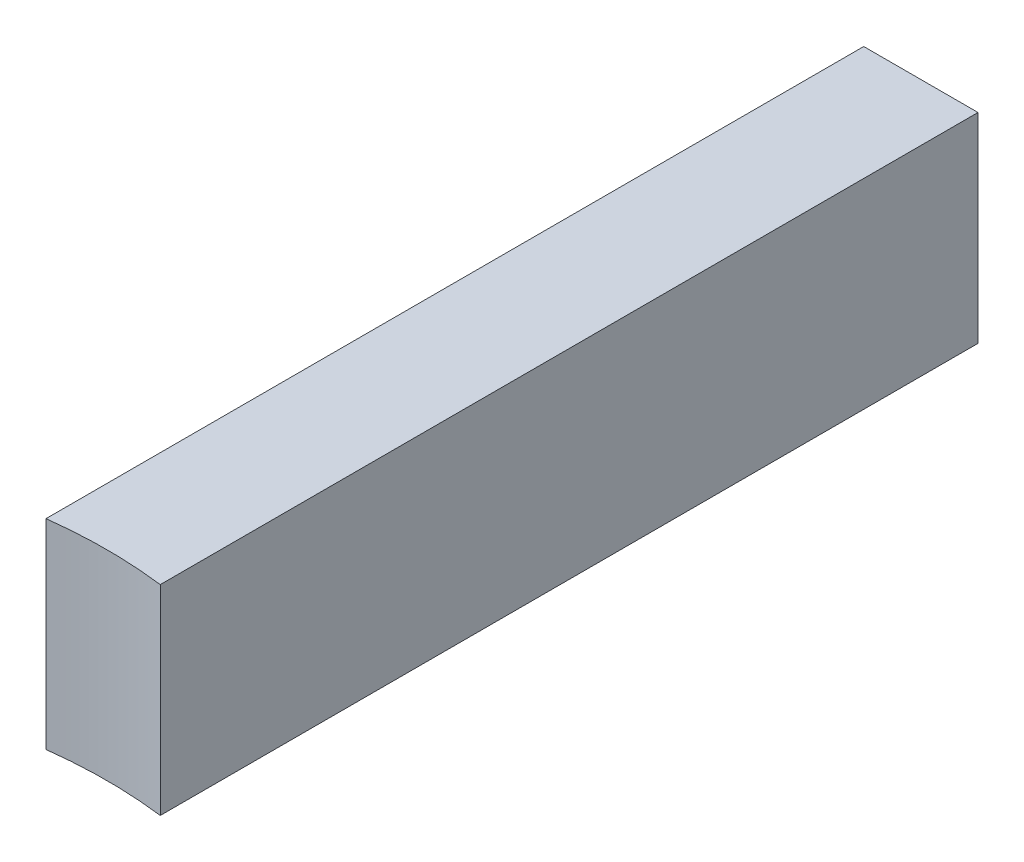
ISO-10303-21;
HEADER;
FILE_DESCRIPTION(('STEP AP214'),'2;1');
FILE_NAME('part.step','',(''),(''),'','','');
FILE_SCHEMA(('AUTOMOTIVE_DESIGN { 1 0 10303 214 1 1 1 1 }'));
ENDSEC;
DATA;
#1=APPLICATION_CONTEXT('core data for automotive mechanical design processes');
#2=APPLICATION_PROTOCOL_DEFINITION('international standard','automotive_design',2000,#1);
#3=PRODUCT_CONTEXT('',#1,'mechanical');
#4=PRODUCT('Part','Part','',(#3));
#5=PRODUCT_RELATED_PRODUCT_CATEGORY('part','',(#4));
#6=PRODUCT_DEFINITION_FORMATION('','',#4);
#7=PRODUCT_DEFINITION_CONTEXT('part definition',#1,'design');
#8=PRODUCT_DEFINITION('design','',#6,#7);
#9=PRODUCT_DEFINITION_SHAPE('','',#8);
#10=(LENGTH_UNIT() NAMED_UNIT(*) SI_UNIT(.MILLI.,.METRE.));
#11=(NAMED_UNIT(*) PLANE_ANGLE_UNIT() SI_UNIT($,.RADIAN.));
#12=(NAMED_UNIT(*) SI_UNIT($,.STERADIAN.) SOLID_ANGLE_UNIT());
#13=UNCERTAINTY_MEASURE_WITH_UNIT(LENGTH_MEASURE(1.E-05),#10,'distance_accuracy_value','');
#14=(GEOMETRIC_REPRESENTATION_CONTEXT(3) GLOBAL_UNCERTAINTY_ASSIGNED_CONTEXT((#13)) GLOBAL_UNIT_ASSIGNED_CONTEXT((#10,
#11,#12)) REPRESENTATION_CONTEXT('',''));
#15=CARTESIAN_POINT('',(0.,0.,0.));
#16=DIRECTION('',(0.,0.,1.));
#17=DIRECTION('',(1.,0.,0.));
#18=AXIS2_PLACEMENT_3D('',#15,#16,#17);
#19=CARTESIAN_POINT('',(140.,1.5,-140.));
#20=DIRECTION('',(0.,0.,1.));
#21=DIRECTION('',(1.,0.,0.));
#22=AXIS2_PLACEMENT_3D('',#19,#20,#21);
#23=PLANE('',#22);
#24=DIRECTION('',(0.,-1.,0.));
#25=VECTOR('',#24,1.);
#26=CARTESIAN_POINT('',(-101.,8.5,-140.));
#27=LINE('',#26,#25);
#28=CARTESIAN_POINT('',(-101.,8.5,-140.));
#29=VERTEX_POINT('',#28);
#30=CARTESIAN_POINT('',(-101.,1.5,-140.));
#31=VERTEX_POINT('',#30);
#32=EDGE_CURVE('E95',#29,#31,#27,.T.);
#33=ORIENTED_EDGE('',*,*,#32,.T.);
#34=DIRECTION('',(-1.,0.,0.));
#35=VECTOR('',#34,1.);
#36=CARTESIAN_POINT('',(-94.0554253226633,1.5,-140.));
#37=LINE('',#36,#35);
#38=CARTESIAN_POINT('',(-105.,1.5,-140.));
#39=VERTEX_POINT('',#38);
#40=EDGE_CURVE('E82',#31,#39,#37,.T.);
#41=ORIENTED_EDGE('',*,*,#40,.T.);
#42=DIRECTION('',(0.,-1.,0.));
#43=VECTOR('',#42,1.);
#44=CARTESIAN_POINT('',(-105.,8.5,-140.));
#45=LINE('',#44,#43);
#46=CARTESIAN_POINT('',(-105.,8.5,-140.));
#47=VERTEX_POINT('',#46);
#48=EDGE_CURVE('E100',#47,#39,#45,.T.);
#49=ORIENTED_EDGE('',*,*,#48,.F.);
#50=DIRECTION('',(-1.,0.,0.));
#51=VECTOR('',#50,1.);
#52=CARTESIAN_POINT('',(-101.,8.5,-140.));
#53=LINE('',#52,#51);
#54=EDGE_CURVE('E99',#29,#47,#53,.T.);
#55=ORIENTED_EDGE('',*,*,#54,.F.);
#56=EDGE_LOOP('',(#33,#41,#49,#55));
#57=FACE_BOUND('',#56,.T.);
#58=ADVANCED_FACE('F45',(#57),#23,.F.);
#59=CARTESIAN_POINT('',(-105.,8.5,-140.));
#60=DIRECTION('',(1.,0.,0.));
#61=DIRECTION('',(0.,0.,-1.));
#62=AXIS2_PLACEMENT_3D('',#59,#60,#61);
#63=PLANE('',#62);
#64=DIRECTION('',(0.,0.,1.));
#65=VECTOR('',#64,1.);
#66=CARTESIAN_POINT('',(-105.,1.5,-140.));
#67=LINE('',#66,#65);
#68=CARTESIAN_POINT('',(-105.,1.5,-111.374507866388));
#69=VERTEX_POINT('',#68);
#70=EDGE_CURVE('E87',#39,#69,#67,.T.);
#71=ORIENTED_EDGE('',*,*,#70,.T.);
#72=DIRECTION('',(0.,-1.,0.));
#73=VECTOR('',#72,1.);
#74=CARTESIAN_POINT('',(-105.,8.5,-111.374507866388));
#75=LINE('',#74,#73);
#76=CARTESIAN_POINT('',(-105.,8.5,-111.374507866388));
#77=VERTEX_POINT('',#76);
#78=EDGE_CURVE('E102',#77,#69,#75,.T.);
#79=ORIENTED_EDGE('',*,*,#78,.F.);
#80=DIRECTION('',(0.,0.,1.));
#81=VECTOR('',#80,1.);
#82=CARTESIAN_POINT('',(-105.,8.5,-140.));
#83=LINE('',#82,#81);
#84=EDGE_CURVE('E108',#47,#77,#83,.T.);
#85=ORIENTED_EDGE('',*,*,#84,.F.);
#86=ORIENTED_EDGE('',*,*,#48,.T.);
#87=EDGE_LOOP('',(#71,#79,#85,#86));
#88=FACE_BOUND('',#87,.T.);
#89=ADVANCED_FACE('F119',(#88),#63,.F.);
#90=CARTESIAN_POINT('',(-101.,8.5,-140.));
#91=DIRECTION('',(-1.,0.,0.));
#92=DIRECTION('',(0.,0.,1.));
#93=AXIS2_PLACEMENT_3D('',#90,#91,#92);
#94=PLANE('',#93);
#95=DIRECTION('',(0.,0.,-1.));
#96=VECTOR('',#95,1.);
#97=CARTESIAN_POINT('',(-101.,1.5,-140.));
#98=LINE('',#97,#96);
#99=CARTESIAN_POINT('',(-101.,1.5,-111.374507866388));
#100=VERTEX_POINT('',#99);
#101=EDGE_CURVE('E53',#100,#31,#98,.T.);
#102=ORIENTED_EDGE('',*,*,#101,.T.);
#103=ORIENTED_EDGE('',*,*,#32,.F.);
#104=DIRECTION('',(0.,0.,-1.));
#105=VECTOR('',#104,1.);
#106=CARTESIAN_POINT('',(-101.,8.5,-140.));
#107=LINE('',#106,#105);
#108=CARTESIAN_POINT('',(-101.,8.5,-111.374507866388));
#109=VERTEX_POINT('',#108);
#110=EDGE_CURVE('E60',#109,#29,#107,.T.);
#111=ORIENTED_EDGE('',*,*,#110,.F.);
#112=DIRECTION('',(0.,-1.,0.));
#113=VECTOR('',#112,1.);
#114=CARTESIAN_POINT('',(-101.,8.5,-111.374507866388));
#115=LINE('',#114,#113);
#116=EDGE_CURVE('E92',#109,#100,#115,.T.);
#117=ORIENTED_EDGE('',*,*,#116,.T.);
#118=EDGE_LOOP('',(#102,#103,#111,#117));
#119=FACE_BOUND('',#118,.T.);
#120=ADVANCED_FACE('F94',(#119),#94,.F.);
#121=CARTESIAN_POINT('',(-103.,1.5,-95.5));
#122=DIRECTION('',(0.,-1.,0.));
#123=DIRECTION('',(0.,0.,-1.));
#124=AXIS2_PLACEMENT_3D('',#121,#122,#123);
#125=CYLINDRICAL_SURFACE('',#124,16.);
#126=CARTESIAN_POINT('',(-103.,1.5,-95.5));
#127=DIRECTION('',(0.,1.,0.));
#128=DIRECTION('',(0.,0.,1.));
#129=AXIS2_PLACEMENT_3D('',#126,#127,#128);
#130=CIRCLE('',#129,16.);
#131=EDGE_CURVE('E11',#100,#69,#130,.T.);
#132=ORIENTED_EDGE('',*,*,#131,.F.);
#133=ORIENTED_EDGE('',*,*,#116,.F.);
#134=CARTESIAN_POINT('',(-103.,8.5,-95.5));
#135=DIRECTION('',(0.,-1.,0.));
#136=DIRECTION('',(0.,0.,1.));
#137=AXIS2_PLACEMENT_3D('',#134,#135,#136);
#138=CIRCLE('',#137,16.);
#139=EDGE_CURVE('E109',#77,#109,#138,.T.);
#140=ORIENTED_EDGE('',*,*,#139,.F.);
#141=ORIENTED_EDGE('',*,*,#78,.T.);
#142=EDGE_LOOP('',(#132,#133,#140,#141));
#143=FACE_BOUND('',#142,.T.);
#144=ADVANCED_FACE('F47',(#143),#125,.F.);
#145=CARTESIAN_POINT('',(-103.,8.5,-95.5));
#146=DIRECTION('',(0.,1.,0.));
#147=DIRECTION('',(0.,0.,1.));
#148=AXIS2_PLACEMENT_3D('',#145,#146,#147);
#149=PLANE('',#148);
#150=ORIENTED_EDGE('',*,*,#139,.T.);
#151=ORIENTED_EDGE('',*,*,#110,.T.);
#152=ORIENTED_EDGE('',*,*,#54,.T.);
#153=ORIENTED_EDGE('',*,*,#84,.T.);
#154=EDGE_LOOP('',(#150,#151,#152,#153));
#155=FACE_BOUND('',#154,.T.);
#156=ADVANCED_FACE('F114',(#155),#149,.T.);
#157=CARTESIAN_POINT('',(-94.0554253226633,1.5,-109.324258492628));
#158=DIRECTION('',(0.,1.,0.));
#159=DIRECTION('',(0.,0.,1.));
#160=AXIS2_PLACEMENT_3D('',#157,#158,#159);
#161=PLANE('',#160);
#162=ORIENTED_EDGE('',*,*,#40,.F.);
#163=ORIENTED_EDGE('',*,*,#101,.F.);
#164=ORIENTED_EDGE('',*,*,#131,.T.);
#165=ORIENTED_EDGE('',*,*,#70,.F.);
#166=EDGE_LOOP('',(#162,#163,#164,#165));
#167=FACE_BOUND('',#166,.T.);
#168=ADVANCED_FACE('F84',(#167),#161,.F.);
#169=CLOSED_SHELL('',(#58,#89,#120,#144,#156,#168));
#170=MANIFOLD_SOLID_BREP('B2',#169);
#171=ADVANCED_BREP_SHAPE_REPRESENTATION('',(#18,#170),#14);
#172=SHAPE_DEFINITION_REPRESENTATION(#9,#171);
ENDSEC;
END-ISO-10303-21;
